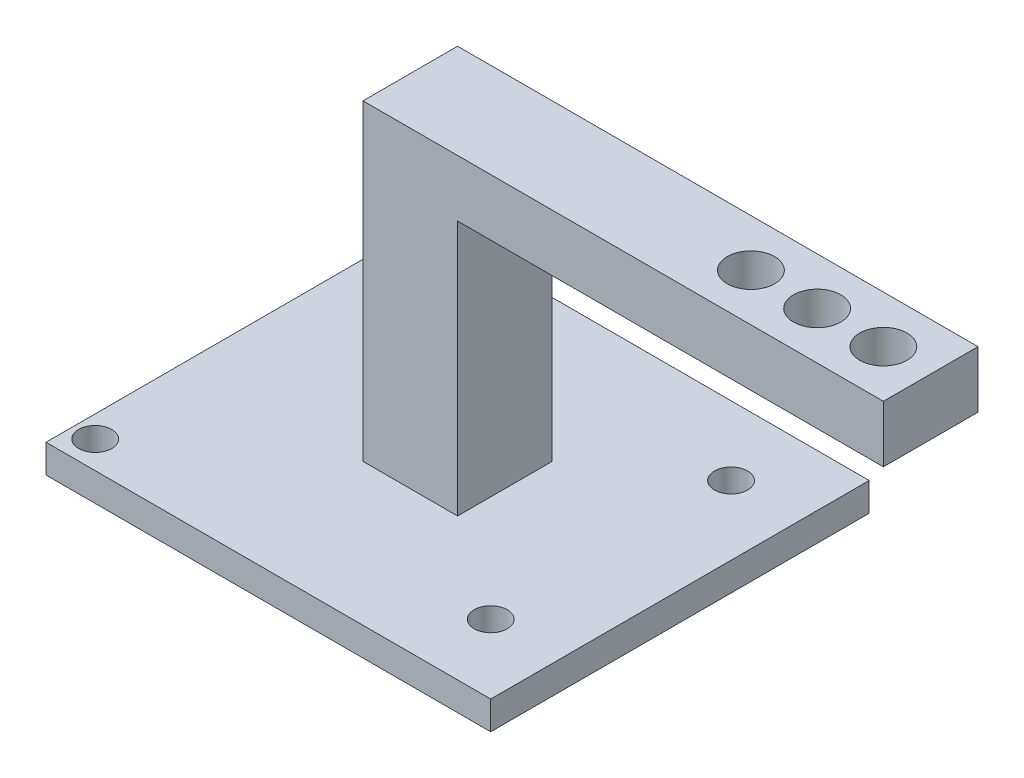
ISO-10303-21;
HEADER;
FILE_DESCRIPTION(('STEP AP214'),'2;1');
FILE_NAME('part.step','',(''),(''),'','','');
FILE_SCHEMA(('AUTOMOTIVE_DESIGN { 1 0 10303 214 1 1 1 1 }'));
ENDSEC;
DATA;
#1=APPLICATION_CONTEXT('core data for automotive mechanical design processes');
#2=APPLICATION_PROTOCOL_DEFINITION('international standard','automotive_design',2000,#1);
#3=PRODUCT_CONTEXT('',#1,'mechanical');
#4=PRODUCT('Part','Part','',(#3));
#5=PRODUCT_RELATED_PRODUCT_CATEGORY('part','',(#4));
#6=PRODUCT_DEFINITION_FORMATION('','',#4);
#7=PRODUCT_DEFINITION_CONTEXT('part definition',#1,'design');
#8=PRODUCT_DEFINITION('design','',#6,#7);
#9=PRODUCT_DEFINITION_SHAPE('','',#8);
#10=(LENGTH_UNIT() NAMED_UNIT(*) SI_UNIT(.MILLI.,.METRE.));
#11=(NAMED_UNIT(*) PLANE_ANGLE_UNIT() SI_UNIT($,.RADIAN.));
#12=(NAMED_UNIT(*) SI_UNIT($,.STERADIAN.) SOLID_ANGLE_UNIT());
#13=UNCERTAINTY_MEASURE_WITH_UNIT(LENGTH_MEASURE(1.E-05),#10,'distance_accuracy_value','');
#14=(GEOMETRIC_REPRESENTATION_CONTEXT(3) GLOBAL_UNCERTAINTY_ASSIGNED_CONTEXT((#13)) GLOBAL_UNIT_ASSIGNED_CONTEXT((#10,
#11,#12)) REPRESENTATION_CONTEXT('',''));
#15=CARTESIAN_POINT('',(0.,0.,0.));
#16=DIRECTION('',(0.,0.,1.));
#17=DIRECTION('',(1.,0.,0.));
#18=AXIS2_PLACEMENT_3D('',#15,#16,#17);
#19=CARTESIAN_POINT('',(18.5,30.,-25.));
#20=DIRECTION('',(1.,0.,0.));
#21=DIRECTION('',(0.,0.,-1.));
#22=AXIS2_PLACEMENT_3D('',#19,#20,#21);
#23=PLANE('',#22);
#24=DIRECTION('',(0.,-1.,0.));
#25=VECTOR('',#24,1.);
#26=CARTESIAN_POINT('',(18.5,30.,-15.));
#27=LINE('',#26,#25);
#28=CARTESIAN_POINT('',(18.5,36.,-15.));
#29=VERTEX_POINT('',#28);
#30=CARTESIAN_POINT('',(18.5,3.,-15.));
#31=VERTEX_POINT('',#30);
#32=EDGE_CURVE('E122',#29,#31,#27,.T.);
#33=ORIENTED_EDGE('',*,*,#32,.F.);
#34=DIRECTION('',(0.,0.,1.));
#35=VECTOR('',#34,1.);
#36=CARTESIAN_POINT('',(18.5,36.,-25.));
#37=LINE('',#36,#35);
#38=CARTESIAN_POINT('',(18.5,36.,-25.));
#39=VERTEX_POINT('',#38);
#40=EDGE_CURVE('E125',#39,#29,#37,.T.);
#41=ORIENTED_EDGE('',*,*,#40,.F.);
#42=DIRECTION('',(0.,-1.,0.));
#43=VECTOR('',#42,1.);
#44=CARTESIAN_POINT('',(18.5,30.,-25.));
#45=LINE('',#44,#43);
#46=CARTESIAN_POINT('',(18.5,3.,-25.));
#47=VERTEX_POINT('',#46);
#48=EDGE_CURVE('E166',#39,#47,#45,.T.);
#49=ORIENTED_EDGE('',*,*,#48,.T.);
#50=DIRECTION('',(0.,0.,1.));
#51=VECTOR('',#50,1.);
#52=CARTESIAN_POINT('',(18.5,3.,-25.));
#53=LINE('',#52,#51);
#54=EDGE_CURVE('E127',#47,#31,#53,.T.);
#55=ORIENTED_EDGE('',*,*,#54,.T.);
#56=EDGE_LOOP('',(#33,#41,#49,#55));
#57=FACE_BOUND('',#56,.T.);
#58=ADVANCED_FACE('F35',(#57),#23,.F.);
#59=CARTESIAN_POINT('',(18.5,30.,-15.));
#60=DIRECTION('',(0.,0.,-1.));
#61=DIRECTION('',(-1.,0.,0.));
#62=AXIS2_PLACEMENT_3D('',#59,#60,#61);
#63=PLANE('',#62);
#64=DIRECTION('',(0.,-1.,0.));
#65=VECTOR('',#64,1.);
#66=CARTESIAN_POINT('',(28.5,30.,-15.));
#67=LINE('',#66,#65);
#68=CARTESIAN_POINT('',(28.5,30.,-15.));
#69=VERTEX_POINT('',#68);
#70=CARTESIAN_POINT('',(28.5,3.,-15.));
#71=VERTEX_POINT('',#70);
#72=EDGE_CURVE('E131',#69,#71,#67,.T.);
#73=ORIENTED_EDGE('',*,*,#72,.F.);
#74=DIRECTION('',(1.,0.,0.));
#75=VECTOR('',#74,1.);
#76=CARTESIAN_POINT('',(18.5,30.,-15.));
#77=LINE('',#76,#75);
#78=CARTESIAN_POINT('',(73.5,30.,-15.));
#79=VERTEX_POINT('',#78);
#80=EDGE_CURVE('E157',#69,#79,#77,.T.);
#81=ORIENTED_EDGE('',*,*,#80,.T.);
#82=DIRECTION('',(0.,-1.,0.));
#83=VECTOR('',#82,1.);
#84=CARTESIAN_POINT('',(73.5,36.,-15.));
#85=LINE('',#84,#83);
#86=CARTESIAN_POINT('',(73.5,36.,-15.));
#87=VERTEX_POINT('',#86);
#88=EDGE_CURVE('E137',#87,#79,#85,.T.);
#89=ORIENTED_EDGE('',*,*,#88,.F.);
#90=DIRECTION('',(1.,0.,0.));
#91=VECTOR('',#90,1.);
#92=CARTESIAN_POINT('',(18.5,36.,-15.));
#93=LINE('',#92,#91);
#94=EDGE_CURVE('E134',#29,#87,#93,.T.);
#95=ORIENTED_EDGE('',*,*,#94,.F.);
#96=ORIENTED_EDGE('',*,*,#32,.T.);
#97=DIRECTION('',(1.,0.,0.));
#98=VECTOR('',#97,1.);
#99=CARTESIAN_POINT('',(18.5,3.,-15.));
#100=LINE('',#99,#98);
#101=EDGE_CURVE('E169',#31,#71,#100,.T.);
#102=ORIENTED_EDGE('',*,*,#101,.T.);
#103=EDGE_LOOP('',(#73,#81,#89,#95,#96,#102));
#104=FACE_BOUND('',#103,.T.);
#105=ADVANCED_FACE('F135',(#104),#63,.F.);
#106=CARTESIAN_POINT('',(18.5,30.,-25.));
#107=DIRECTION('',(0.,0.,1.));
#108=DIRECTION('',(1.,0.,0.));
#109=AXIS2_PLACEMENT_3D('',#106,#107,#108);
#110=PLANE('',#109);
#111=ORIENTED_EDGE('',*,*,#48,.F.);
#112=DIRECTION('',(-1.,0.,0.));
#113=VECTOR('',#112,1.);
#114=CARTESIAN_POINT('',(18.5,36.,-25.));
#115=LINE('',#114,#113);
#116=CARTESIAN_POINT('',(73.5,36.,-25.));
#117=VERTEX_POINT('',#116);
#118=EDGE_CURVE('E145',#117,#39,#115,.T.);
#119=ORIENTED_EDGE('',*,*,#118,.F.);
#120=DIRECTION('',(0.,-1.,0.));
#121=VECTOR('',#120,1.);
#122=CARTESIAN_POINT('',(73.5,36.,-25.));
#123=LINE('',#122,#121);
#124=CARTESIAN_POINT('',(73.5,30.,-25.));
#125=VERTEX_POINT('',#124);
#126=EDGE_CURVE('E156',#117,#125,#123,.T.);
#127=ORIENTED_EDGE('',*,*,#126,.T.);
#128=DIRECTION('',(-1.,0.,0.));
#129=VECTOR('',#128,1.);
#130=CARTESIAN_POINT('',(18.5,30.,-25.));
#131=LINE('',#130,#129);
#132=CARTESIAN_POINT('',(28.5,30.,-25.));
#133=VERTEX_POINT('',#132);
#134=EDGE_CURVE('E146',#125,#133,#131,.T.);
#135=ORIENTED_EDGE('',*,*,#134,.T.);
#136=DIRECTION('',(0.,-1.,0.));
#137=VECTOR('',#136,1.);
#138=CARTESIAN_POINT('',(28.5,30.,-25.));
#139=LINE('',#138,#137);
#140=CARTESIAN_POINT('',(28.5,3.,-25.));
#141=VERTEX_POINT('',#140);
#142=EDGE_CURVE('E50',#133,#141,#139,.T.);
#143=ORIENTED_EDGE('',*,*,#142,.T.);
#144=DIRECTION('',(-1.,0.,0.));
#145=VECTOR('',#144,1.);
#146=CARTESIAN_POINT('',(18.5,3.,-25.));
#147=LINE('',#146,#145);
#148=EDGE_CURVE('E167',#141,#47,#147,.T.);
#149=ORIENTED_EDGE('',*,*,#148,.T.);
#150=EDGE_LOOP('',(#111,#119,#127,#135,#143,#149));
#151=FACE_BOUND('',#150,.T.);
#152=ADVANCED_FACE('F250',(#151),#110,.F.);
#153=CARTESIAN_POINT('',(0.,3.,0.));
#154=DIRECTION('',(0.,1.,0.));
#155=DIRECTION('',(0.,0.,1.));
#156=AXIS2_PLACEMENT_3D('',#153,#154,#155);
#157=PLANE('',#156);
#158=CARTESIAN_POINT('',(2.3,3.,-2.9));
#159=DIRECTION('',(0.,1.,0.));
#160=DIRECTION('',(0.,0.,1.));
#161=AXIS2_PLACEMENT_3D('',#158,#159,#160);
#162=CIRCLE('',#161,1.75);
#163=CARTESIAN_POINT('',(2.3,3.,-1.15));
#164=VERTEX_POINT('',#163);
#165=EDGE_CURVE('E178',#164,#164,#162,.T.);
#166=ORIENTED_EDGE('',*,*,#165,.F.);
#167=EDGE_LOOP('',(#166));
#168=FACE_BOUND('',#167,.T.);
#169=CARTESIAN_POINT('',(2.3,3.,-37.1));
#170=DIRECTION('',(0.,1.,0.));
#171=DIRECTION('',(0.,0.,1.));
#172=AXIS2_PLACEMENT_3D('',#169,#170,#171);
#173=CIRCLE('',#172,1.75);
#174=CARTESIAN_POINT('',(2.3,3.,-35.35));
#175=VERTEX_POINT('',#174);
#176=EDGE_CURVE('E181',#175,#175,#173,.T.);
#177=ORIENTED_EDGE('',*,*,#176,.F.);
#178=EDGE_LOOP('',(#177));
#179=FACE_BOUND('',#178,.T.);
#180=CARTESIAN_POINT('',(39.7,3.,-32.7));
#181=DIRECTION('',(0.,1.,0.));
#182=DIRECTION('',(0.,0.,1.));
#183=AXIS2_PLACEMENT_3D('',#180,#181,#182);
#184=CIRCLE('',#183,1.75);
#185=CARTESIAN_POINT('',(39.7,3.,-30.95));
#186=VERTEX_POINT('',#185);
#187=EDGE_CURVE('E184',#186,#186,#184,.T.);
#188=ORIENTED_EDGE('',*,*,#187,.F.);
#189=EDGE_LOOP('',(#188));
#190=FACE_BOUND('',#189,.T.);
#191=CARTESIAN_POINT('',(39.7,3.,-7.3));
#192=DIRECTION('',(0.,1.,0.));
#193=DIRECTION('',(0.,0.,1.));
#194=AXIS2_PLACEMENT_3D('',#191,#192,#193);
#195=CIRCLE('',#194,1.75);
#196=CARTESIAN_POINT('',(39.7,3.,-5.55));
#197=VERTEX_POINT('',#196);
#198=EDGE_CURVE('E187',#197,#197,#195,.T.);
#199=ORIENTED_EDGE('',*,*,#198,.F.);
#200=EDGE_LOOP('',(#199));
#201=FACE_BOUND('',#200,.T.);
#202=DIRECTION('',(-1.,0.,0.));
#203=VECTOR('',#202,1.);
#204=CARTESIAN_POINT('',(0.,3.,-40.));
#205=LINE('',#204,#203);
#206=CARTESIAN_POINT('',(47.,3.,-40.));
#207=VERTEX_POINT('',#206);
#208=CARTESIAN_POINT('',(0.,3.,-40.));
#209=VERTEX_POINT('',#208);
#210=EDGE_CURVE('E190',#207,#209,#205,.T.);
#211=ORIENTED_EDGE('',*,*,#210,.T.);
#212=DIRECTION('',(0.,0.,1.));
#213=VECTOR('',#212,1.);
#214=CARTESIAN_POINT('',(0.,3.,0.));
#215=LINE('',#214,#213);
#216=CARTESIAN_POINT('',(0.,3.,0.));
#217=VERTEX_POINT('',#216);
#218=EDGE_CURVE('E87',#209,#217,#215,.T.);
#219=ORIENTED_EDGE('',*,*,#218,.T.);
#220=DIRECTION('',(1.,0.,0.));
#221=VECTOR('',#220,1.);
#222=CARTESIAN_POINT('',(0.,3.,0.));
#223=LINE('',#222,#221);
#224=CARTESIAN_POINT('',(47.,3.,0.));
#225=VERTEX_POINT('',#224);
#226=EDGE_CURVE('E193',#217,#225,#223,.T.);
#227=ORIENTED_EDGE('',*,*,#226,.T.);
#228=DIRECTION('',(0.,0.,-1.));
#229=VECTOR('',#228,1.);
#230=CARTESIAN_POINT('',(47.,3.,0.));
#231=LINE('',#230,#229);
#232=EDGE_CURVE('E59',#225,#207,#231,.T.);
#233=ORIENTED_EDGE('',*,*,#232,.T.);
#234=EDGE_LOOP('',(#211,#219,#227,#233));
#235=FACE_BOUND('',#234,.T.);
#236=ORIENTED_EDGE('',*,*,#101,.F.);
#237=ORIENTED_EDGE('',*,*,#54,.F.);
#238=ORIENTED_EDGE('',*,*,#148,.F.);
#239=DIRECTION('',(0.,0.,-1.));
#240=VECTOR('',#239,1.);
#241=CARTESIAN_POINT('',(28.5,3.,-25.));
#242=LINE('',#241,#240);
#243=EDGE_CURVE('E171',#71,#141,#242,.T.);
#244=ORIENTED_EDGE('',*,*,#243,.F.);
#245=EDGE_LOOP('',(#236,#237,#238,#244));
#246=FACE_BOUND('',#245,.T.);
#247=ADVANCED_FACE('F254',(#168,#179,#190,#201,#235,#246),#157,.T.);
#248=CARTESIAN_POINT('',(0.,3.,-40.));
#249=DIRECTION('',(0.,0.,1.));
#250=DIRECTION('',(1.,0.,0.));
#251=AXIS2_PLACEMENT_3D('',#248,#249,#250);
#252=PLANE('',#251);
#253=DIRECTION('',(-1.,0.,0.));
#254=VECTOR('',#253,1.);
#255=CARTESIAN_POINT('',(0.,0.,-40.));
#256=LINE('',#255,#254);
#257=CARTESIAN_POINT('',(47.,0.,-40.));
#258=VERTEX_POINT('',#257);
#259=CARTESIAN_POINT('',(0.,0.,-40.));
#260=VERTEX_POINT('',#259);
#261=EDGE_CURVE('E208',#258,#260,#256,.T.);
#262=ORIENTED_EDGE('',*,*,#261,.T.);
#263=DIRECTION('',(0.,-1.,0.));
#264=VECTOR('',#263,1.);
#265=CARTESIAN_POINT('',(0.,3.,-40.));
#266=LINE('',#265,#264);
#267=EDGE_CURVE('E11',#209,#260,#266,.T.);
#268=ORIENTED_EDGE('',*,*,#267,.F.);
#269=ORIENTED_EDGE('',*,*,#210,.F.);
#270=DIRECTION('',(0.,-1.,0.));
#271=VECTOR('',#270,1.);
#272=CARTESIAN_POINT('',(47.,3.,-40.));
#273=LINE('',#272,#271);
#274=EDGE_CURVE('E196',#207,#258,#273,.T.);
#275=ORIENTED_EDGE('',*,*,#274,.T.);
#276=EDGE_LOOP('',(#262,#268,#269,#275));
#277=FACE_BOUND('',#276,.T.);
#278=ADVANCED_FACE('F229',(#277),#252,.F.);
#279=CARTESIAN_POINT('',(0.,3.,0.));
#280=DIRECTION('',(1.,0.,0.));
#281=DIRECTION('',(0.,0.,-1.));
#282=AXIS2_PLACEMENT_3D('',#279,#280,#281);
#283=PLANE('',#282);
#284=DIRECTION('',(0.,0.,1.));
#285=VECTOR('',#284,1.);
#286=CARTESIAN_POINT('',(0.,0.,0.));
#287=LINE('',#286,#285);
#288=CARTESIAN_POINT('',(0.,0.,0.));
#289=VERTEX_POINT('',#288);
#290=EDGE_CURVE('E211',#260,#289,#287,.T.);
#291=ORIENTED_EDGE('',*,*,#290,.T.);
#292=DIRECTION('',(0.,-1.,0.));
#293=VECTOR('',#292,1.);
#294=CARTESIAN_POINT('',(0.,3.,0.));
#295=LINE('',#294,#293);
#296=EDGE_CURVE('E43',#217,#289,#295,.T.);
#297=ORIENTED_EDGE('',*,*,#296,.F.);
#298=ORIENTED_EDGE('',*,*,#218,.F.);
#299=ORIENTED_EDGE('',*,*,#267,.T.);
#300=EDGE_LOOP('',(#291,#297,#298,#299));
#301=FACE_BOUND('',#300,.T.);
#302=ADVANCED_FACE('F260',(#301),#283,.F.);
#303=CARTESIAN_POINT('',(0.,3.,0.));
#304=DIRECTION('',(0.,0.,-1.));
#305=DIRECTION('',(-1.,0.,0.));
#306=AXIS2_PLACEMENT_3D('',#303,#304,#305);
#307=PLANE('',#306);
#308=DIRECTION('',(1.,0.,0.));
#309=VECTOR('',#308,1.);
#310=CARTESIAN_POINT('',(0.,0.,0.));
#311=LINE('',#310,#309);
#312=CARTESIAN_POINT('',(47.,0.,0.));
#313=VERTEX_POINT('',#312);
#314=EDGE_CURVE('E213',#289,#313,#311,.T.);
#315=ORIENTED_EDGE('',*,*,#314,.T.);
#316=DIRECTION('',(0.,-1.,0.));
#317=VECTOR('',#316,1.);
#318=CARTESIAN_POINT('',(47.,3.,0.));
#319=LINE('',#318,#317);
#320=EDGE_CURVE('E217',#225,#313,#319,.T.);
#321=ORIENTED_EDGE('',*,*,#320,.F.);
#322=ORIENTED_EDGE('',*,*,#226,.F.);
#323=ORIENTED_EDGE('',*,*,#296,.T.);
#324=EDGE_LOOP('',(#315,#321,#322,#323));
#325=FACE_BOUND('',#324,.T.);
#326=ADVANCED_FACE('F222',(#325),#307,.F.);
#327=CARTESIAN_POINT('',(39.7,3.,-7.3));
#328=DIRECTION('',(0.,-1.,0.));
#329=DIRECTION('',(0.,0.,-1.));
#330=AXIS2_PLACEMENT_3D('',#327,#328,#329);
#331=CYLINDRICAL_SURFACE('',#330,1.75);
#332=ORIENTED_EDGE('',*,*,#198,.T.);
#333=EDGE_LOOP('',(#332));
#334=FACE_BOUND('',#333,.T.);
#335=CARTESIAN_POINT('',(39.7,0.,-7.3));
#336=DIRECTION('',(0.,1.,0.));
#337=DIRECTION('',(0.,0.,1.));
#338=AXIS2_PLACEMENT_3D('',#335,#336,#337);
#339=CIRCLE('',#338,1.75);
#340=CARTESIAN_POINT('',(39.7,0.,-5.55));
#341=VERTEX_POINT('',#340);
#342=EDGE_CURVE('E205',#341,#341,#339,.T.);
#343=ORIENTED_EDGE('',*,*,#342,.F.);
#344=EDGE_LOOP('',(#343));
#345=FACE_BOUND('',#344,.T.);
#346=ADVANCED_FACE('F422',(#334,#345),#331,.F.);
#347=CARTESIAN_POINT('',(39.7,3.,-32.7));
#348=DIRECTION('',(0.,-1.,0.));
#349=DIRECTION('',(0.,0.,-1.));
#350=AXIS2_PLACEMENT_3D('',#347,#348,#349);
#351=CYLINDRICAL_SURFACE('',#350,1.75);
#352=ORIENTED_EDGE('',*,*,#187,.T.);
#353=EDGE_LOOP('',(#352));
#354=FACE_BOUND('',#353,.T.);
#355=CARTESIAN_POINT('',(39.7,0.,-32.7));
#356=DIRECTION('',(0.,1.,0.));
#357=DIRECTION('',(0.,0.,1.));
#358=AXIS2_PLACEMENT_3D('',#355,#356,#357);
#359=CIRCLE('',#358,1.75);
#360=CARTESIAN_POINT('',(39.7,0.,-30.95));
#361=VERTEX_POINT('',#360);
#362=EDGE_CURVE('E202',#361,#361,#359,.T.);
#363=ORIENTED_EDGE('',*,*,#362,.F.);
#364=EDGE_LOOP('',(#363));
#365=FACE_BOUND('',#364,.T.);
#366=ADVANCED_FACE('F413',(#354,#365),#351,.F.);
#367=CARTESIAN_POINT('',(2.3,3.,-37.1));
#368=DIRECTION('',(0.,-1.,0.));
#369=DIRECTION('',(0.,0.,-1.));
#370=AXIS2_PLACEMENT_3D('',#367,#368,#369);
#371=CYLINDRICAL_SURFACE('',#370,1.75);
#372=ORIENTED_EDGE('',*,*,#176,.T.);
#373=EDGE_LOOP('',(#372));
#374=FACE_BOUND('',#373,.T.);
#375=CARTESIAN_POINT('',(2.3,0.,-37.1));
#376=DIRECTION('',(0.,1.,0.));
#377=DIRECTION('',(0.,0.,1.));
#378=AXIS2_PLACEMENT_3D('',#375,#376,#377);
#379=CIRCLE('',#378,1.75);
#380=CARTESIAN_POINT('',(2.3,0.,-35.35));
#381=VERTEX_POINT('',#380);
#382=EDGE_CURVE('E199',#381,#381,#379,.T.);
#383=ORIENTED_EDGE('',*,*,#382,.F.);
#384=EDGE_LOOP('',(#383));
#385=FACE_BOUND('',#384,.T.);
#386=ADVANCED_FACE('F241',(#374,#385),#371,.F.);
#387=CARTESIAN_POINT('',(2.3,3.,-2.9));
#388=DIRECTION('',(0.,-1.,0.));
#389=DIRECTION('',(0.,0.,-1.));
#390=AXIS2_PLACEMENT_3D('',#387,#388,#389);
#391=CYLINDRICAL_SURFACE('',#390,1.75);
#392=ORIENTED_EDGE('',*,*,#165,.T.);
#393=EDGE_LOOP('',(#392));
#394=FACE_BOUND('',#393,.T.);
#395=CARTESIAN_POINT('',(2.3,0.,-2.9));
#396=DIRECTION('',(0.,1.,0.));
#397=DIRECTION('',(0.,0.,1.));
#398=AXIS2_PLACEMENT_3D('',#395,#396,#397);
#399=CIRCLE('',#398,1.75);
#400=CARTESIAN_POINT('',(2.3,0.,-1.15));
#401=VERTEX_POINT('',#400);
#402=EDGE_CURVE('E130',#401,#401,#399,.T.);
#403=ORIENTED_EDGE('',*,*,#402,.F.);
#404=EDGE_LOOP('',(#403));
#405=FACE_BOUND('',#404,.T.);
#406=ADVANCED_FACE('F37',(#394,#405),#391,.F.);
#407=CARTESIAN_POINT('',(47.,3.,0.));
#408=DIRECTION('',(-1.,0.,0.));
#409=DIRECTION('',(0.,0.,1.));
#410=AXIS2_PLACEMENT_3D('',#407,#408,#409);
#411=PLANE('',#410);
#412=DIRECTION('',(0.,0.,-1.));
#413=VECTOR('',#412,1.);
#414=CARTESIAN_POINT('',(47.,0.,0.));
#415=LINE('',#414,#413);
#416=EDGE_CURVE('E80',#313,#258,#415,.T.);
#417=ORIENTED_EDGE('',*,*,#416,.T.);
#418=ORIENTED_EDGE('',*,*,#274,.F.);
#419=ORIENTED_EDGE('',*,*,#232,.F.);
#420=ORIENTED_EDGE('',*,*,#320,.T.);
#421=EDGE_LOOP('',(#417,#418,#419,#420));
#422=FACE_BOUND('',#421,.T.);
#423=ADVANCED_FACE('F231',(#422),#411,.F.);
#424=CARTESIAN_POINT('',(0.,0.,0.));
#425=DIRECTION('',(0.,1.,0.));
#426=DIRECTION('',(0.,0.,1.));
#427=AXIS2_PLACEMENT_3D('',#424,#425,#426);
#428=PLANE('',#427);
#429=ORIENTED_EDGE('',*,*,#402,.T.);
#430=EDGE_LOOP('',(#429));
#431=FACE_BOUND('',#430,.T.);
#432=ORIENTED_EDGE('',*,*,#382,.T.);
#433=EDGE_LOOP('',(#432));
#434=FACE_BOUND('',#433,.T.);
#435=ORIENTED_EDGE('',*,*,#362,.T.);
#436=EDGE_LOOP('',(#435));
#437=FACE_BOUND('',#436,.T.);
#438=ORIENTED_EDGE('',*,*,#342,.T.);
#439=EDGE_LOOP('',(#438));
#440=FACE_BOUND('',#439,.T.);
#441=ORIENTED_EDGE('',*,*,#261,.F.);
#442=ORIENTED_EDGE('',*,*,#416,.F.);
#443=ORIENTED_EDGE('',*,*,#314,.F.);
#444=ORIENTED_EDGE('',*,*,#290,.F.);
#445=EDGE_LOOP('',(#441,#442,#443,#444));
#446=FACE_BOUND('',#445,.T.);
#447=ADVANCED_FACE('F226',(#431,#434,#437,#440,#446),#428,.F.);
#448=CARTESIAN_POINT('',(28.5,30.,-25.));
#449=DIRECTION('',(-1.,0.,0.));
#450=DIRECTION('',(0.,0.,1.));
#451=AXIS2_PLACEMENT_3D('',#448,#449,#450);
#452=PLANE('',#451);
#453=ORIENTED_EDGE('',*,*,#243,.T.);
#454=ORIENTED_EDGE('',*,*,#142,.F.);
#455=DIRECTION('',(0.,0.,-1.));
#456=VECTOR('',#455,1.);
#457=CARTESIAN_POINT('',(28.5,30.,-25.));
#458=LINE('',#457,#456);
#459=EDGE_CURVE('E163',#69,#133,#458,.T.);
#460=ORIENTED_EDGE('',*,*,#459,.F.);
#461=ORIENTED_EDGE('',*,*,#72,.T.);
#462=EDGE_LOOP('',(#453,#454,#460,#461));
#463=FACE_BOUND('',#462,.T.);
#464=ADVANCED_FACE('F238',(#463),#452,.F.);
#465=CARTESIAN_POINT('',(0.,30.,0.));
#466=DIRECTION('',(0.,1.,0.));
#467=DIRECTION('',(0.,0.,1.));
#468=AXIS2_PLACEMENT_3D('',#465,#466,#467);
#469=PLANE('',#468);
#470=CARTESIAN_POINT('',(68.5,30.,-20.));
#471=DIRECTION('',(0.,1.,0.));
#472=DIRECTION('',(0.,0.,1.));
#473=AXIS2_PLACEMENT_3D('',#470,#471,#472);
#474=CIRCLE('',#473,2.5);
#475=CARTESIAN_POINT('',(68.5,30.,-17.5));
#476=VERTEX_POINT('',#475);
#477=EDGE_CURVE('E151',#476,#476,#474,.T.);
#478=ORIENTED_EDGE('',*,*,#477,.T.);
#479=EDGE_LOOP('',(#478));
#480=FACE_BOUND('',#479,.T.);
#481=CARTESIAN_POINT('',(61.5,30.,-20.));
#482=DIRECTION('',(0.,1.,0.));
#483=DIRECTION('',(0.,0.,1.));
#484=AXIS2_PLACEMENT_3D('',#481,#482,#483);
#485=CIRCLE('',#484,2.50000000000002);
#486=CARTESIAN_POINT('',(61.5,30.,-17.5));
#487=VERTEX_POINT('',#486);
#488=EDGE_CURVE('E354',#487,#487,#485,.T.);
#489=ORIENTED_EDGE('',*,*,#488,.T.);
#490=EDGE_LOOP('',(#489));
#491=FACE_BOUND('',#490,.T.);
#492=CARTESIAN_POINT('',(54.5,30.,-20.));
#493=DIRECTION('',(0.,1.,0.));
#494=DIRECTION('',(0.,0.,1.));
#495=AXIS2_PLACEMENT_3D('',#492,#493,#494);
#496=CIRCLE('',#495,2.5);
#497=CARTESIAN_POINT('',(54.5,30.,-17.5));
#498=VERTEX_POINT('',#497);
#499=EDGE_CURVE('E356',#498,#498,#496,.T.);
#500=ORIENTED_EDGE('',*,*,#499,.T.);
#501=EDGE_LOOP('',(#500));
#502=FACE_BOUND('',#501,.T.);
#503=ORIENTED_EDGE('',*,*,#80,.F.);
#504=ORIENTED_EDGE('',*,*,#459,.T.);
#505=ORIENTED_EDGE('',*,*,#134,.F.);
#506=DIRECTION('',(0.,0.,-1.));
#507=VECTOR('',#506,1.);
#508=CARTESIAN_POINT('',(73.5,30.,-15.));
#509=LINE('',#508,#507);
#510=EDGE_CURVE('E148',#79,#125,#509,.T.);
#511=ORIENTED_EDGE('',*,*,#510,.F.);
#512=EDGE_LOOP('',(#503,#504,#505,#511));
#513=FACE_BOUND('',#512,.T.);
#514=ADVANCED_FACE('F280',(#480,#491,#502,#513),#469,.F.);
#515=CARTESIAN_POINT('',(73.5,36.,-15.));
#516=DIRECTION('',(-1.,0.,0.));
#517=DIRECTION('',(0.,0.,1.));
#518=AXIS2_PLACEMENT_3D('',#515,#516,#517);
#519=PLANE('',#518);
#520=ORIENTED_EDGE('',*,*,#510,.T.);
#521=ORIENTED_EDGE('',*,*,#126,.F.);
#522=DIRECTION('',(0.,0.,-1.));
#523=VECTOR('',#522,1.);
#524=CARTESIAN_POINT('',(73.5,36.,-15.));
#525=LINE('',#524,#523);
#526=EDGE_CURVE('E140',#87,#117,#525,.T.);
#527=ORIENTED_EDGE('',*,*,#526,.F.);
#528=ORIENTED_EDGE('',*,*,#88,.T.);
#529=EDGE_LOOP('',(#520,#521,#527,#528));
#530=FACE_BOUND('',#529,.T.);
#531=ADVANCED_FACE('F282',(#530),#519,.F.);
#532=CARTESIAN_POINT('',(0.,36.,0.));
#533=DIRECTION('',(0.,1.,0.));
#534=DIRECTION('',(0.,0.,1.));
#535=AXIS2_PLACEMENT_3D('',#532,#533,#534);
#536=PLANE('',#535);
#537=CARTESIAN_POINT('',(68.5,36.,-20.));
#538=DIRECTION('',(0.,1.,0.));
#539=DIRECTION('',(0.,0.,1.));
#540=AXIS2_PLACEMENT_3D('',#537,#538,#539);
#541=CIRCLE('',#540,2.5);
#542=CARTESIAN_POINT('',(68.5,36.,-17.5));
#543=VERTEX_POINT('',#542);
#544=EDGE_CURVE('E351',#543,#543,#541,.T.);
#545=ORIENTED_EDGE('',*,*,#544,.F.);
#546=EDGE_LOOP('',(#545));
#547=FACE_BOUND('',#546,.T.);
#548=CARTESIAN_POINT('',(61.5,36.,-20.));
#549=DIRECTION('',(0.,1.,0.));
#550=DIRECTION('',(0.,0.,1.));
#551=AXIS2_PLACEMENT_3D('',#548,#549,#550);
#552=CIRCLE('',#551,2.50000000000002);
#553=CARTESIAN_POINT('',(61.5,36.,-17.5));
#554=VERTEX_POINT('',#553);
#555=EDGE_CURVE('E365',#554,#554,#552,.T.);
#556=ORIENTED_EDGE('',*,*,#555,.F.);
#557=EDGE_LOOP('',(#556));
#558=FACE_BOUND('',#557,.T.);
#559=CARTESIAN_POINT('',(54.5,36.,-20.));
#560=DIRECTION('',(0.,1.,0.));
#561=DIRECTION('',(0.,0.,1.));
#562=AXIS2_PLACEMENT_3D('',#559,#560,#561);
#563=CIRCLE('',#562,2.5);
#564=CARTESIAN_POINT('',(54.5,36.,-17.5));
#565=VERTEX_POINT('',#564);
#566=EDGE_CURVE('E362',#565,#565,#563,.T.);
#567=ORIENTED_EDGE('',*,*,#566,.F.);
#568=EDGE_LOOP('',(#567));
#569=FACE_BOUND('',#568,.T.);
#570=ORIENTED_EDGE('',*,*,#40,.T.);
#571=ORIENTED_EDGE('',*,*,#94,.T.);
#572=ORIENTED_EDGE('',*,*,#526,.T.);
#573=ORIENTED_EDGE('',*,*,#118,.T.);
#574=EDGE_LOOP('',(#570,#571,#572,#573));
#575=FACE_BOUND('',#574,.T.);
#576=ADVANCED_FACE('F143',(#547,#558,#569,#575),#536,.T.);
#577=CARTESIAN_POINT('',(54.5,0.,-20.));
#578=DIRECTION('',(0.,1.,0.));
#579=DIRECTION('',(0.,0.,1.));
#580=AXIS2_PLACEMENT_3D('',#577,#578,#579);
#581=CYLINDRICAL_SURFACE('',#580,2.5);
#582=ORIENTED_EDGE('',*,*,#566,.T.);
#583=EDGE_LOOP('',(#582));
#584=FACE_BOUND('',#583,.T.);
#585=ORIENTED_EDGE('',*,*,#499,.F.);
#586=EDGE_LOOP('',(#585));
#587=FACE_BOUND('',#586,.T.);
#588=ADVANCED_FACE('F290',(#584,#587),#581,.F.);
#589=CARTESIAN_POINT('',(61.5,0.,-20.));
#590=DIRECTION('',(0.,1.,0.));
#591=DIRECTION('',(0.,0.,1.));
#592=AXIS2_PLACEMENT_3D('',#589,#590,#591);
#593=CYLINDRICAL_SURFACE('',#592,2.50000000000002);
#594=ORIENTED_EDGE('',*,*,#555,.T.);
#595=EDGE_LOOP('',(#594));
#596=FACE_BOUND('',#595,.T.);
#597=ORIENTED_EDGE('',*,*,#488,.F.);
#598=EDGE_LOOP('',(#597));
#599=FACE_BOUND('',#598,.T.);
#600=ADVANCED_FACE('F324',(#596,#599),#593,.F.);
#601=CARTESIAN_POINT('',(68.5,0.,-20.));
#602=DIRECTION('',(0.,1.,0.));
#603=DIRECTION('',(0.,0.,1.));
#604=AXIS2_PLACEMENT_3D('',#601,#602,#603);
#605=CYLINDRICAL_SURFACE('',#604,2.5);
#606=ORIENTED_EDGE('',*,*,#544,.T.);
#607=EDGE_LOOP('',(#606));
#608=FACE_BOUND('',#607,.T.);
#609=ORIENTED_EDGE('',*,*,#477,.F.);
#610=EDGE_LOOP('',(#609));
#611=FACE_BOUND('',#610,.T.);
#612=ADVANCED_FACE('F334',(#608,#611),#605,.F.);
#613=CLOSED_SHELL('',(#58,#105,#152,#247,#278,#302,#326,#346,#366,#386,#406,#423,#447,#464,#514,
#531,#576,#588,#600,#612));
#614=MANIFOLD_SOLID_BREP('B2',#613);
#615=ADVANCED_BREP_SHAPE_REPRESENTATION('',(#18,#614),#14);
#616=SHAPE_DEFINITION_REPRESENTATION(#9,#615);
ENDSEC;
END-ISO-10303-21;
